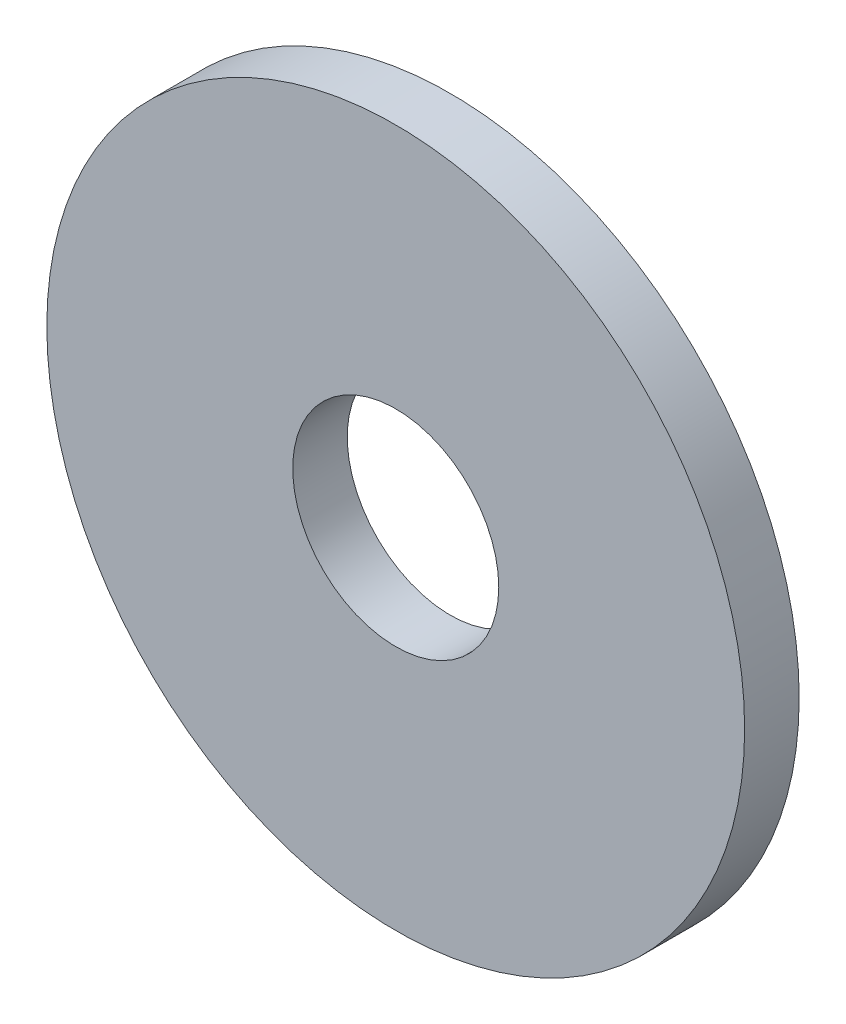
ISO-10303-21;
HEADER;
FILE_DESCRIPTION(('STEP AP214'),'2;1');
FILE_NAME('part.step','',(''),(''),'','','');
FILE_SCHEMA(('AUTOMOTIVE_DESIGN { 1 0 10303 214 1 1 1 1 }'));
ENDSEC;
DATA;
#1=APPLICATION_CONTEXT('core data for automotive mechanical design processes');
#2=APPLICATION_PROTOCOL_DEFINITION('international standard','automotive_design',2000,#1);
#3=PRODUCT_CONTEXT('',#1,'mechanical');
#4=PRODUCT('Part','Part','',(#3));
#5=PRODUCT_RELATED_PRODUCT_CATEGORY('part','',(#4));
#6=PRODUCT_DEFINITION_FORMATION('','',#4);
#7=PRODUCT_DEFINITION_CONTEXT('part definition',#1,'design');
#8=PRODUCT_DEFINITION('design','',#6,#7);
#9=PRODUCT_DEFINITION_SHAPE('','',#8);
#10=(LENGTH_UNIT() NAMED_UNIT(*) SI_UNIT(.MILLI.,.METRE.));
#11=(NAMED_UNIT(*) PLANE_ANGLE_UNIT() SI_UNIT($,.RADIAN.));
#12=(NAMED_UNIT(*) SI_UNIT($,.STERADIAN.) SOLID_ANGLE_UNIT());
#13=UNCERTAINTY_MEASURE_WITH_UNIT(LENGTH_MEASURE(1.E-05),#10,'distance_accuracy_value','');
#14=(GEOMETRIC_REPRESENTATION_CONTEXT(3) GLOBAL_UNCERTAINTY_ASSIGNED_CONTEXT((#13)) GLOBAL_UNIT_ASSIGNED_CONTEXT((#10,
#11,#12)) REPRESENTATION_CONTEXT('',''));
#15=CARTESIAN_POINT('',(0.,0.,0.));
#16=DIRECTION('',(0.,0.,1.));
#17=DIRECTION('',(1.,0.,0.));
#18=AXIS2_PLACEMENT_3D('',#15,#16,#17);
#19=CARTESIAN_POINT('',(0.,0.,15.875));
#20=DIRECTION('',(0.,0.,1.));
#21=DIRECTION('',(1.,0.,0.));
#22=AXIS2_PLACEMENT_3D('',#19,#20,#21);
#23=PLANE('',#22);
#24=CARTESIAN_POINT('',(0.,0.,15.875));
#25=DIRECTION('',(0.,0.,1.));
#26=DIRECTION('',(1.,0.,0.));
#27=AXIS2_PLACEMENT_3D('',#24,#25,#26);
#28=CIRCLE('',#27,101.6);
#29=CARTESIAN_POINT('',(101.6,0.,15.875));
#30=VERTEX_POINT('',#29);
#31=EDGE_CURVE('E10',#30,#30,#28,.T.);
#32=ORIENTED_EDGE('',*,*,#31,.T.);
#33=EDGE_LOOP('',(#32));
#34=FACE_BOUND('',#33,.T.);
#35=CARTESIAN_POINT('',(0.,0.,15.875));
#36=DIRECTION('',(0.,0.,1.));
#37=DIRECTION('',(1.,0.,0.));
#38=AXIS2_PLACEMENT_3D('',#35,#36,#37);
#39=CIRCLE('',#38,30.);
#40=CARTESIAN_POINT('',(30.,0.,15.875));
#41=VERTEX_POINT('',#40);
#42=EDGE_CURVE('E52',#41,#41,#39,.T.);
#43=ORIENTED_EDGE('',*,*,#42,.F.);
#44=EDGE_LOOP('',(#43));
#45=FACE_BOUND('',#44,.T.);
#46=ADVANCED_FACE('F41',(#34,#45),#23,.T.);
#47=CARTESIAN_POINT('',(0.,0.,0.));
#48=DIRECTION('',(0.,0.,1.));
#49=DIRECTION('',(1.,0.,0.));
#50=AXIS2_PLACEMENT_3D('',#47,#48,#49);
#51=PLANE('',#50);
#52=CARTESIAN_POINT('',(0.,0.,0.));
#53=DIRECTION('',(0.,0.,1.));
#54=DIRECTION('',(1.,0.,0.));
#55=AXIS2_PLACEMENT_3D('',#52,#53,#54);
#56=CIRCLE('',#55,101.6);
#57=CARTESIAN_POINT('',(101.6,0.,0.));
#58=VERTEX_POINT('',#57);
#59=EDGE_CURVE('E45',#58,#58,#56,.T.);
#60=ORIENTED_EDGE('',*,*,#59,.F.);
#61=EDGE_LOOP('',(#60));
#62=FACE_BOUND('',#61,.T.);
#63=CARTESIAN_POINT('',(0.,0.,0.));
#64=DIRECTION('',(0.,0.,1.));
#65=DIRECTION('',(1.,0.,0.));
#66=AXIS2_PLACEMENT_3D('',#63,#64,#65);
#67=CIRCLE('',#66,30.);
#68=CARTESIAN_POINT('',(30.,0.,0.));
#69=VERTEX_POINT('',#68);
#70=EDGE_CURVE('E54',#69,#69,#67,.T.);
#71=ORIENTED_EDGE('',*,*,#70,.T.);
#72=EDGE_LOOP('',(#71));
#73=FACE_BOUND('',#72,.T.);
#74=ADVANCED_FACE('F64',(#62,#73),#51,.F.);
#75=CARTESIAN_POINT('',(0.,0.,15.875));
#76=DIRECTION('',(0.,0.,-1.));
#77=DIRECTION('',(-1.,0.,0.));
#78=AXIS2_PLACEMENT_3D('',#75,#76,#77);
#79=CYLINDRICAL_SURFACE('',#78,101.6);
#80=ORIENTED_EDGE('',*,*,#31,.F.);
#81=EDGE_LOOP('',(#80));
#82=FACE_BOUND('',#81,.T.);
#83=ORIENTED_EDGE('',*,*,#59,.T.);
#84=EDGE_LOOP('',(#83));
#85=FACE_BOUND('',#84,.T.);
#86=ADVANCED_FACE('F43',(#82,#85),#79,.T.);
#87=CARTESIAN_POINT('',(0.,0.,15.875));
#88=DIRECTION('',(0.,0.,-1.));
#89=DIRECTION('',(-1.,0.,0.));
#90=AXIS2_PLACEMENT_3D('',#87,#88,#89);
#91=CYLINDRICAL_SURFACE('',#90,30.);
#92=ORIENTED_EDGE('',*,*,#42,.T.);
#93=EDGE_LOOP('',(#92));
#94=FACE_BOUND('',#93,.T.);
#95=ORIENTED_EDGE('',*,*,#70,.F.);
#96=EDGE_LOOP('',(#95));
#97=FACE_BOUND('',#96,.T.);
#98=ADVANCED_FACE('F60',(#94,#97),#91,.F.);
#99=CLOSED_SHELL('',(#46,#74,#86,#98));
#100=MANIFOLD_SOLID_BREP('B2',#99);
#101=ADVANCED_BREP_SHAPE_REPRESENTATION('',(#18,#100),#14);
#102=SHAPE_DEFINITION_REPRESENTATION(#9,#101);
ENDSEC;
END-ISO-10303-21;
